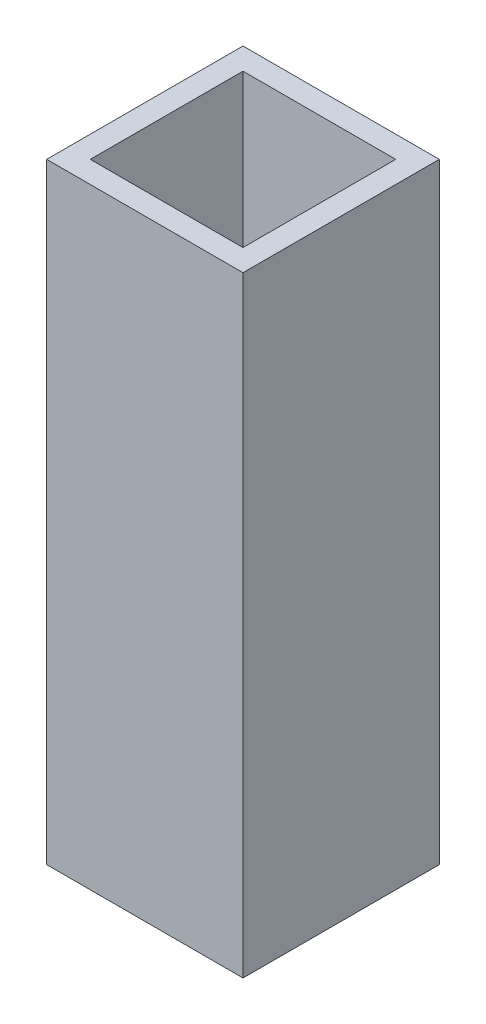
ISO-10303-21;
HEADER;
FILE_DESCRIPTION(('STEP AP214'),'2;1');
FILE_NAME('part.step','',(''),(''),'','','');
FILE_SCHEMA(('AUTOMOTIVE_DESIGN { 1 0 10303 214 1 1 1 1 }'));
ENDSEC;
DATA;
#1=APPLICATION_CONTEXT('core data for automotive mechanical design processes');
#2=APPLICATION_PROTOCOL_DEFINITION('international standard','automotive_design',2000,#1);
#3=PRODUCT_CONTEXT('',#1,'mechanical');
#4=PRODUCT('Part','Part','',(#3));
#5=PRODUCT_RELATED_PRODUCT_CATEGORY('part','',(#4));
#6=PRODUCT_DEFINITION_FORMATION('','',#4);
#7=PRODUCT_DEFINITION_CONTEXT('part definition',#1,'design');
#8=PRODUCT_DEFINITION('design','',#6,#7);
#9=PRODUCT_DEFINITION_SHAPE('','',#8);
#10=(LENGTH_UNIT() NAMED_UNIT(*) SI_UNIT(.MILLI.,.METRE.));
#11=(NAMED_UNIT(*) PLANE_ANGLE_UNIT() SI_UNIT($,.RADIAN.));
#12=(NAMED_UNIT(*) SI_UNIT($,.STERADIAN.) SOLID_ANGLE_UNIT());
#13=UNCERTAINTY_MEASURE_WITH_UNIT(LENGTH_MEASURE(1.E-05),#10,'distance_accuracy_value','');
#14=(GEOMETRIC_REPRESENTATION_CONTEXT(3) GLOBAL_UNCERTAINTY_ASSIGNED_CONTEXT((#13)) GLOBAL_UNIT_ASSIGNED_CONTEXT((#10,
#11,#12)) REPRESENTATION_CONTEXT('',''));
#15=CARTESIAN_POINT('',(0.,0.,0.));
#16=DIRECTION('',(0.,0.,1.));
#17=DIRECTION('',(1.,0.,0.));
#18=AXIS2_PLACEMENT_3D('',#15,#16,#17);
#19=CARTESIAN_POINT('',(0.,21.,0.));
#20=DIRECTION('',(0.,-1.,0.));
#21=DIRECTION('',(0.,0.,-1.));
#22=AXIS2_PLACEMENT_3D('',#19,#20,#21);
#23=PLANE('',#22);
#24=DIRECTION('',(0.,0.,-1.));
#25=VECTOR('',#24,1.);
#26=CARTESIAN_POINT('',(6.75,21.,6.75));
#27=LINE('',#26,#25);
#28=CARTESIAN_POINT('',(6.75,21.,6.75));
#29=VERTEX_POINT('',#28);
#30=CARTESIAN_POINT('',(6.75,21.,-6.75));
#31=VERTEX_POINT('',#30);
#32=EDGE_CURVE('E134',#29,#31,#27,.T.);
#33=ORIENTED_EDGE('',*,*,#32,.T.);
#34=DIRECTION('',(-1.,0.,0.));
#35=VECTOR('',#34,1.);
#36=CARTESIAN_POINT('',(-6.75,21.,-6.75));
#37=LINE('',#36,#35);
#38=CARTESIAN_POINT('',(-6.75,21.,-6.75));
#39=VERTEX_POINT('',#38);
#40=EDGE_CURVE('E137',#31,#39,#37,.T.);
#41=ORIENTED_EDGE('',*,*,#40,.T.);
#42=DIRECTION('',(0.,0.,1.));
#43=VECTOR('',#42,1.);
#44=CARTESIAN_POINT('',(-6.75,21.,6.75));
#45=LINE('',#44,#43);
#46=CARTESIAN_POINT('',(-6.75,21.,6.75));
#47=VERTEX_POINT('',#46);
#48=EDGE_CURVE('E140',#39,#47,#45,.T.);
#49=ORIENTED_EDGE('',*,*,#48,.T.);
#50=DIRECTION('',(1.,0.,0.));
#51=VECTOR('',#50,1.);
#52=CARTESIAN_POINT('',(-6.75,21.,6.75));
#53=LINE('',#52,#51);
#54=EDGE_CURVE('E142',#47,#29,#53,.T.);
#55=ORIENTED_EDGE('',*,*,#54,.T.);
#56=EDGE_LOOP('',(#33,#41,#49,#55));
#57=FACE_BOUND('',#56,.T.);
#58=DIRECTION('',(1.,0.,0.));
#59=VECTOR('',#58,1.);
#60=CARTESIAN_POINT('',(-5.25,21.,5.25));
#61=LINE('',#60,#59);
#62=CARTESIAN_POINT('',(-5.25,21.,5.25));
#63=VERTEX_POINT('',#62);
#64=CARTESIAN_POINT('',(5.25,21.,5.25));
#65=VERTEX_POINT('',#64);
#66=EDGE_CURVE('E98',#63,#65,#61,.T.);
#67=ORIENTED_EDGE('',*,*,#66,.F.);
#68=DIRECTION('',(0.,0.,1.));
#69=VECTOR('',#68,1.);
#70=CARTESIAN_POINT('',(-5.25,21.,5.25));
#71=LINE('',#70,#69);
#72=CARTESIAN_POINT('',(-5.25,21.,-5.25));
#73=VERTEX_POINT('',#72);
#74=EDGE_CURVE('E120',#73,#63,#71,.T.);
#75=ORIENTED_EDGE('',*,*,#74,.F.);
#76=DIRECTION('',(-1.,0.,0.));
#77=VECTOR('',#76,1.);
#78=CARTESIAN_POINT('',(-5.25,21.,-5.25));
#79=LINE('',#78,#77);
#80=CARTESIAN_POINT('',(5.25,21.,-5.25));
#81=VERTEX_POINT('',#80);
#82=EDGE_CURVE('E118',#81,#73,#79,.T.);
#83=ORIENTED_EDGE('',*,*,#82,.F.);
#84=DIRECTION('',(0.,0.,-1.));
#85=VECTOR('',#84,1.);
#86=CARTESIAN_POINT('',(5.25,21.,5.25));
#87=LINE('',#86,#85);
#88=EDGE_CURVE('E106',#65,#81,#87,.T.);
#89=ORIENTED_EDGE('',*,*,#88,.F.);
#90=EDGE_LOOP('',(#67,#75,#83,#89));
#91=FACE_BOUND('',#90,.T.);
#92=ADVANCED_FACE('F33',(#57,#91),#23,.F.);
#93=CARTESIAN_POINT('',(0.,-21.,0.));
#94=DIRECTION('',(0.,-1.,0.));
#95=DIRECTION('',(0.,0.,-1.));
#96=AXIS2_PLACEMENT_3D('',#93,#94,#95);
#97=PLANE('',#96);
#98=DIRECTION('',(0.,0.,-1.));
#99=VECTOR('',#98,1.);
#100=CARTESIAN_POINT('',(6.75,-21.,6.75));
#101=LINE('',#100,#99);
#102=CARTESIAN_POINT('',(6.75,-21.,6.75));
#103=VERTEX_POINT('',#102);
#104=CARTESIAN_POINT('',(6.75,-21.,-6.75));
#105=VERTEX_POINT('',#104);
#106=EDGE_CURVE('E114',#103,#105,#101,.T.);
#107=ORIENTED_EDGE('',*,*,#106,.F.);
#108=DIRECTION('',(1.,0.,0.));
#109=VECTOR('',#108,1.);
#110=CARTESIAN_POINT('',(-6.75,-21.,6.75));
#111=LINE('',#110,#109);
#112=CARTESIAN_POINT('',(-6.75,-21.,6.75));
#113=VERTEX_POINT('',#112);
#114=EDGE_CURVE('E138',#113,#103,#111,.T.);
#115=ORIENTED_EDGE('',*,*,#114,.F.);
#116=DIRECTION('',(0.,0.,1.));
#117=VECTOR('',#116,1.);
#118=CARTESIAN_POINT('',(-6.75,-21.,6.75));
#119=LINE('',#118,#117);
#120=CARTESIAN_POINT('',(-6.75,-21.,-6.75));
#121=VERTEX_POINT('',#120);
#122=EDGE_CURVE('E149',#121,#113,#119,.T.);
#123=ORIENTED_EDGE('',*,*,#122,.F.);
#124=DIRECTION('',(-1.,0.,0.));
#125=VECTOR('',#124,1.);
#126=CARTESIAN_POINT('',(-6.75,-21.,-6.75));
#127=LINE('',#126,#125);
#128=EDGE_CURVE('E147',#105,#121,#127,.T.);
#129=ORIENTED_EDGE('',*,*,#128,.F.);
#130=EDGE_LOOP('',(#107,#115,#123,#129));
#131=FACE_BOUND('',#130,.T.);
#132=DIRECTION('',(0.,0.,1.));
#133=VECTOR('',#132,1.);
#134=CARTESIAN_POINT('',(-5.25,-21.,5.25));
#135=LINE('',#134,#133);
#136=CARTESIAN_POINT('',(-5.25,-21.,-5.25));
#137=VERTEX_POINT('',#136);
#138=CARTESIAN_POINT('',(-5.25,-21.,5.25));
#139=VERTEX_POINT('',#138);
#140=EDGE_CURVE('E107',#137,#139,#135,.T.);
#141=ORIENTED_EDGE('',*,*,#140,.T.);
#142=DIRECTION('',(1.,0.,0.));
#143=VECTOR('',#142,1.);
#144=CARTESIAN_POINT('',(-5.25,-21.,5.25));
#145=LINE('',#144,#143);
#146=CARTESIAN_POINT('',(5.25,-21.,5.25));
#147=VERTEX_POINT('',#146);
#148=EDGE_CURVE('E56',#139,#147,#145,.T.);
#149=ORIENTED_EDGE('',*,*,#148,.T.);
#150=DIRECTION('',(0.,0.,-1.));
#151=VECTOR('',#150,1.);
#152=CARTESIAN_POINT('',(5.25,-21.,5.25));
#153=LINE('',#152,#151);
#154=CARTESIAN_POINT('',(5.25,-21.,-5.25));
#155=VERTEX_POINT('',#154);
#156=EDGE_CURVE('E113',#147,#155,#153,.T.);
#157=ORIENTED_EDGE('',*,*,#156,.T.);
#158=DIRECTION('',(-1.,0.,0.));
#159=VECTOR('',#158,1.);
#160=CARTESIAN_POINT('',(-5.25,-21.,-5.25));
#161=LINE('',#160,#159);
#162=EDGE_CURVE('E126',#155,#137,#161,.T.);
#163=ORIENTED_EDGE('',*,*,#162,.T.);
#164=EDGE_LOOP('',(#141,#149,#157,#163));
#165=FACE_BOUND('',#164,.T.);
#166=ADVANCED_FACE('F167',(#131,#165),#97,.T.);
#167=CARTESIAN_POINT('',(6.75,21.,6.75));
#168=DIRECTION('',(-1.,0.,0.));
#169=DIRECTION('',(0.,0.,1.));
#170=AXIS2_PLACEMENT_3D('',#167,#168,#169);
#171=PLANE('',#170);
#172=ORIENTED_EDGE('',*,*,#106,.T.);
#173=DIRECTION('',(0.,-1.,0.));
#174=VECTOR('',#173,1.);
#175=CARTESIAN_POINT('',(6.75,21.,-6.75));
#176=LINE('',#175,#174);
#177=EDGE_CURVE('E11',#31,#105,#176,.T.);
#178=ORIENTED_EDGE('',*,*,#177,.F.);
#179=ORIENTED_EDGE('',*,*,#32,.F.);
#180=DIRECTION('',(0.,-1.,0.));
#181=VECTOR('',#180,1.);
#182=CARTESIAN_POINT('',(6.75,21.,6.75));
#183=LINE('',#182,#181);
#184=EDGE_CURVE('E144',#29,#103,#183,.T.);
#185=ORIENTED_EDGE('',*,*,#184,.T.);
#186=EDGE_LOOP('',(#172,#178,#179,#185));
#187=FACE_BOUND('',#186,.T.);
#188=ADVANCED_FACE('F35',(#187),#171,.F.);
#189=CARTESIAN_POINT('',(-6.75,21.,-6.75));
#190=DIRECTION('',(0.,0.,1.));
#191=DIRECTION('',(1.,0.,0.));
#192=AXIS2_PLACEMENT_3D('',#189,#190,#191);
#193=PLANE('',#192);
#194=ORIENTED_EDGE('',*,*,#128,.T.);
#195=DIRECTION('',(0.,-1.,0.));
#196=VECTOR('',#195,1.);
#197=CARTESIAN_POINT('',(-6.75,21.,-6.75));
#198=LINE('',#197,#196);
#199=EDGE_CURVE('E41',#39,#121,#198,.T.);
#200=ORIENTED_EDGE('',*,*,#199,.F.);
#201=ORIENTED_EDGE('',*,*,#40,.F.);
#202=ORIENTED_EDGE('',*,*,#177,.T.);
#203=EDGE_LOOP('',(#194,#200,#201,#202));
#204=FACE_BOUND('',#203,.T.);
#205=ADVANCED_FACE('F177',(#204),#193,.F.);
#206=CARTESIAN_POINT('',(-6.75,21.,6.75));
#207=DIRECTION('',(1.,0.,0.));
#208=DIRECTION('',(0.,0.,-1.));
#209=AXIS2_PLACEMENT_3D('',#206,#207,#208);
#210=PLANE('',#209);
#211=ORIENTED_EDGE('',*,*,#122,.T.);
#212=DIRECTION('',(0.,-1.,0.));
#213=VECTOR('',#212,1.);
#214=CARTESIAN_POINT('',(-6.75,21.,6.75));
#215=LINE('',#214,#213);
#216=EDGE_CURVE('E154',#47,#113,#215,.T.);
#217=ORIENTED_EDGE('',*,*,#216,.F.);
#218=ORIENTED_EDGE('',*,*,#48,.F.);
#219=ORIENTED_EDGE('',*,*,#199,.T.);
#220=EDGE_LOOP('',(#211,#217,#218,#219));
#221=FACE_BOUND('',#220,.T.);
#222=ADVANCED_FACE('F161',(#221),#210,.F.);
#223=CARTESIAN_POINT('',(-6.75,21.,6.75));
#224=DIRECTION('',(0.,0.,-1.));
#225=DIRECTION('',(-1.,0.,0.));
#226=AXIS2_PLACEMENT_3D('',#223,#224,#225);
#227=PLANE('',#226);
#228=ORIENTED_EDGE('',*,*,#114,.T.);
#229=ORIENTED_EDGE('',*,*,#184,.F.);
#230=ORIENTED_EDGE('',*,*,#54,.F.);
#231=ORIENTED_EDGE('',*,*,#216,.T.);
#232=EDGE_LOOP('',(#228,#229,#230,#231));
#233=FACE_BOUND('',#232,.T.);
#234=ADVANCED_FACE('F171',(#233),#227,.F.);
#235=CARTESIAN_POINT('',(-5.25,21.,5.25));
#236=DIRECTION('',(0.,0.,-1.));
#237=DIRECTION('',(-1.,0.,0.));
#238=AXIS2_PLACEMENT_3D('',#235,#236,#237);
#239=PLANE('',#238);
#240=ORIENTED_EDGE('',*,*,#148,.F.);
#241=DIRECTION('',(0.,-1.,0.));
#242=VECTOR('',#241,1.);
#243=CARTESIAN_POINT('',(-5.25,21.,5.25));
#244=LINE('',#243,#242);
#245=EDGE_CURVE('E102',#63,#139,#244,.T.);
#246=ORIENTED_EDGE('',*,*,#245,.F.);
#247=ORIENTED_EDGE('',*,*,#66,.T.);
#248=DIRECTION('',(0.,-1.,0.));
#249=VECTOR('',#248,1.);
#250=CARTESIAN_POINT('',(5.25,21.,5.25));
#251=LINE('',#250,#249);
#252=EDGE_CURVE('E101',#65,#147,#251,.T.);
#253=ORIENTED_EDGE('',*,*,#252,.T.);
#254=EDGE_LOOP('',(#240,#246,#247,#253));
#255=FACE_BOUND('',#254,.T.);
#256=ADVANCED_FACE('F100',(#255),#239,.T.);
#257=CARTESIAN_POINT('',(5.25,21.,5.25));
#258=DIRECTION('',(-1.,0.,0.));
#259=DIRECTION('',(0.,0.,1.));
#260=AXIS2_PLACEMENT_3D('',#257,#258,#259);
#261=PLANE('',#260);
#262=ORIENTED_EDGE('',*,*,#156,.F.);
#263=ORIENTED_EDGE('',*,*,#252,.F.);
#264=ORIENTED_EDGE('',*,*,#88,.T.);
#265=DIRECTION('',(0.,-1.,0.));
#266=VECTOR('',#265,1.);
#267=CARTESIAN_POINT('',(5.25,21.,-5.25));
#268=LINE('',#267,#266);
#269=EDGE_CURVE('E115',#81,#155,#268,.T.);
#270=ORIENTED_EDGE('',*,*,#269,.T.);
#271=EDGE_LOOP('',(#262,#263,#264,#270));
#272=FACE_BOUND('',#271,.T.);
#273=ADVANCED_FACE('F110',(#272),#261,.T.);
#274=CARTESIAN_POINT('',(-5.25,21.,-5.25));
#275=DIRECTION('',(0.,0.,1.));
#276=DIRECTION('',(1.,0.,0.));
#277=AXIS2_PLACEMENT_3D('',#274,#275,#276);
#278=PLANE('',#277);
#279=ORIENTED_EDGE('',*,*,#162,.F.);
#280=ORIENTED_EDGE('',*,*,#269,.F.);
#281=ORIENTED_EDGE('',*,*,#82,.T.);
#282=DIRECTION('',(0.,-1.,0.));
#283=VECTOR('',#282,1.);
#284=CARTESIAN_POINT('',(-5.25,21.,-5.25));
#285=LINE('',#284,#283);
#286=EDGE_CURVE('E48',#73,#137,#285,.T.);
#287=ORIENTED_EDGE('',*,*,#286,.T.);
#288=EDGE_LOOP('',(#279,#280,#281,#287));
#289=FACE_BOUND('',#288,.T.);
#290=ADVANCED_FACE('F200',(#289),#278,.T.);
#291=CARTESIAN_POINT('',(-5.25,21.,5.25));
#292=DIRECTION('',(1.,0.,0.));
#293=DIRECTION('',(0.,0.,-1.));
#294=AXIS2_PLACEMENT_3D('',#291,#292,#293);
#295=PLANE('',#294);
#296=ORIENTED_EDGE('',*,*,#140,.F.);
#297=ORIENTED_EDGE('',*,*,#286,.F.);
#298=ORIENTED_EDGE('',*,*,#74,.T.);
#299=ORIENTED_EDGE('',*,*,#245,.T.);
#300=EDGE_LOOP('',(#296,#297,#298,#299));
#301=FACE_BOUND('',#300,.T.);
#302=ADVANCED_FACE('F204',(#301),#295,.T.);
#303=CLOSED_SHELL('',(#92,#166,#188,#205,#222,#234,#256,#273,#290,#302));
#304=MANIFOLD_SOLID_BREP('B2',#303);
#305=ADVANCED_BREP_SHAPE_REPRESENTATION('',(#18,#304),#14);
#306=SHAPE_DEFINITION_REPRESENTATION(#9,#305);
ENDSEC;
END-ISO-10303-21;
